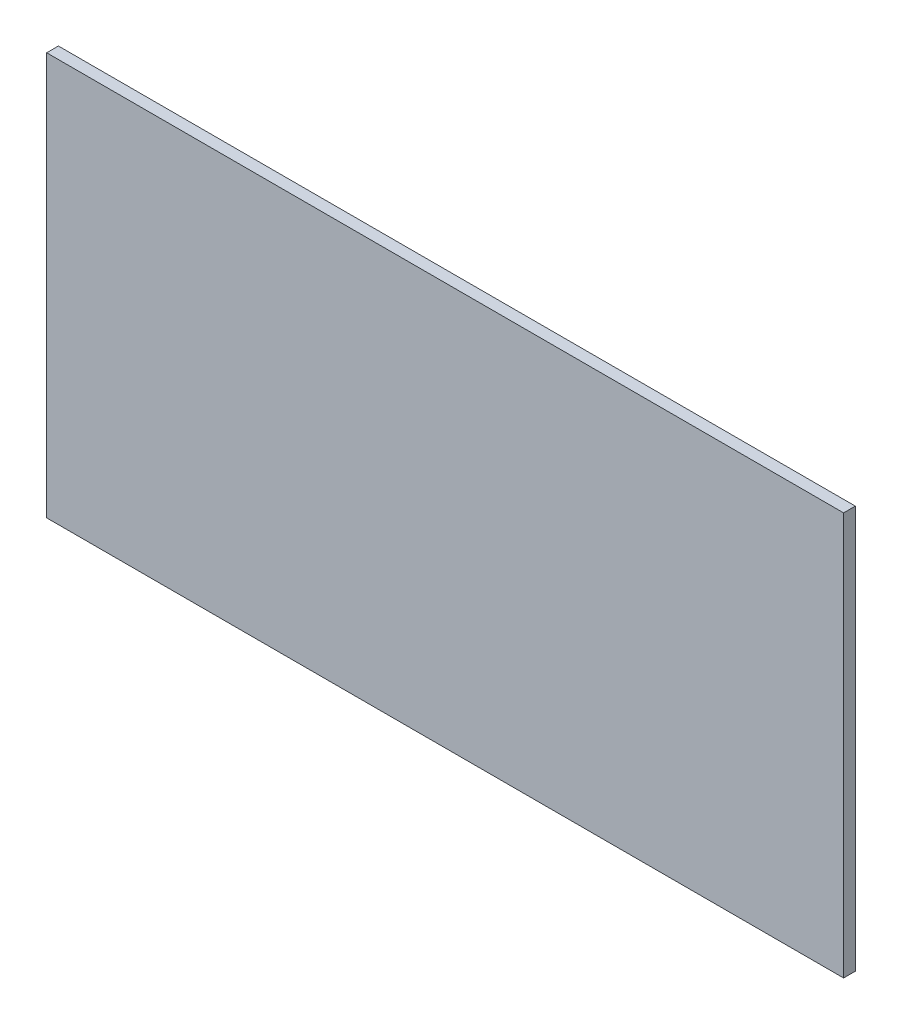
ISO-10303-21;
HEADER;
FILE_DESCRIPTION(('STEP AP214'),'2;1');
FILE_NAME('part.step','',(''),(''),'','','');
FILE_SCHEMA(('AUTOMOTIVE_DESIGN { 1 0 10303 214 1 1 1 1 }'));
ENDSEC;
DATA;
#1=APPLICATION_CONTEXT('core data for automotive mechanical design processes');
#2=APPLICATION_PROTOCOL_DEFINITION('international standard','automotive_design',2000,#1);
#3=PRODUCT_CONTEXT('',#1,'mechanical');
#4=PRODUCT('Part','Part','',(#3));
#5=PRODUCT_RELATED_PRODUCT_CATEGORY('part','',(#4));
#6=PRODUCT_DEFINITION_FORMATION('','',#4);
#7=PRODUCT_DEFINITION_CONTEXT('part definition',#1,'design');
#8=PRODUCT_DEFINITION('design','',#6,#7);
#9=PRODUCT_DEFINITION_SHAPE('','',#8);
#10=(LENGTH_UNIT() NAMED_UNIT(*) SI_UNIT(.MILLI.,.METRE.));
#11=(NAMED_UNIT(*) PLANE_ANGLE_UNIT() SI_UNIT($,.RADIAN.));
#12=(NAMED_UNIT(*) SI_UNIT($,.STERADIAN.) SOLID_ANGLE_UNIT());
#13=UNCERTAINTY_MEASURE_WITH_UNIT(LENGTH_MEASURE(1.E-05),#10,'distance_accuracy_value','');
#14=(GEOMETRIC_REPRESENTATION_CONTEXT(3) GLOBAL_UNCERTAINTY_ASSIGNED_CONTEXT((#13)) GLOBAL_UNIT_ASSIGNED_CONTEXT((#10,
#11,#12)) REPRESENTATION_CONTEXT('',''));
#15=CARTESIAN_POINT('',(0.,0.,0.));
#16=DIRECTION('',(0.,0.,1.));
#17=DIRECTION('',(1.,0.,0.));
#18=AXIS2_PLACEMENT_3D('',#15,#16,#17);
#19=CARTESIAN_POINT('',(54.3900748038679,27.4927932858967,1.6));
#20=DIRECTION('',(-1.,0.,0.));
#21=DIRECTION('',(0.,0.,1.));
#22=AXIS2_PLACEMENT_3D('',#19,#20,#21);
#23=PLANE('',#22);
#24=DIRECTION('',(0.,1.,0.));
#25=VECTOR('',#24,1.);
#26=CARTESIAN_POINT('',(54.3900748038679,27.4927932858967,0.));
#27=LINE('',#26,#25);
#28=CARTESIAN_POINT('',(54.3900748038679,-27.4927932858967,0.));
#29=VERTEX_POINT('',#28);
#30=CARTESIAN_POINT('',(54.3900748038679,27.4927932858967,0.));
#31=VERTEX_POINT('',#30);
#32=EDGE_CURVE('E96',#29,#31,#27,.T.);
#33=ORIENTED_EDGE('',*,*,#32,.T.);
#34=DIRECTION('',(0.,0.,-1.));
#35=VECTOR('',#34,1.);
#36=CARTESIAN_POINT('',(54.3900748038679,27.4927932858967,1.6));
#37=LINE('',#36,#35);
#38=CARTESIAN_POINT('',(54.3900748038679,27.4927932858967,1.6));
#39=VERTEX_POINT('',#38);
#40=EDGE_CURVE('E11',#39,#31,#37,.T.);
#41=ORIENTED_EDGE('',*,*,#40,.F.);
#42=DIRECTION('',(0.,1.,0.));
#43=VECTOR('',#42,1.);
#44=CARTESIAN_POINT('',(54.3900748038679,27.4927932858967,1.6));
#45=LINE('',#44,#43);
#46=CARTESIAN_POINT('',(54.3900748038679,-27.4927932858967,1.6));
#47=VERTEX_POINT('',#46);
#48=EDGE_CURVE('E84',#47,#39,#45,.T.);
#49=ORIENTED_EDGE('',*,*,#48,.F.);
#50=DIRECTION('',(0.,0.,-1.));
#51=VECTOR('',#50,1.);
#52=CARTESIAN_POINT('',(54.3900748038679,-27.4927932858967,1.6));
#53=LINE('',#52,#51);
#54=EDGE_CURVE('E92',#47,#29,#53,.T.);
#55=ORIENTED_EDGE('',*,*,#54,.T.);
#56=EDGE_LOOP('',(#33,#41,#49,#55));
#57=FACE_BOUND('',#56,.T.);
#58=ADVANCED_FACE('F33',(#57),#23,.F.);
#59=CARTESIAN_POINT('',(-54.3900748038679,27.4927932858967,1.6));
#60=DIRECTION('',(0.,-1.,0.));
#61=DIRECTION('',(0.,0.,-1.));
#62=AXIS2_PLACEMENT_3D('',#59,#60,#61);
#63=PLANE('',#62);
#64=DIRECTION('',(-1.,0.,0.));
#65=VECTOR('',#64,1.);
#66=CARTESIAN_POINT('',(-54.3900748038679,27.4927932858967,0.));
#67=LINE('',#66,#65);
#68=CARTESIAN_POINT('',(-54.3900748038679,27.4927932858967,0.));
#69=VERTEX_POINT('',#68);
#70=EDGE_CURVE('E88',#31,#69,#67,.T.);
#71=ORIENTED_EDGE('',*,*,#70,.T.);
#72=DIRECTION('',(0.,0.,-1.));
#73=VECTOR('',#72,1.);
#74=CARTESIAN_POINT('',(-54.3900748038679,27.4927932858967,1.6));
#75=LINE('',#74,#73);
#76=CARTESIAN_POINT('',(-54.3900748038679,27.4927932858967,1.6));
#77=VERTEX_POINT('',#76);
#78=EDGE_CURVE('E41',#77,#69,#75,.T.);
#79=ORIENTED_EDGE('',*,*,#78,.F.);
#80=DIRECTION('',(-1.,0.,0.));
#81=VECTOR('',#80,1.);
#82=CARTESIAN_POINT('',(-54.3900748038679,27.4927932858967,1.6));
#83=LINE('',#82,#81);
#84=EDGE_CURVE('E79',#39,#77,#83,.T.);
#85=ORIENTED_EDGE('',*,*,#84,.F.);
#86=ORIENTED_EDGE('',*,*,#40,.T.);
#87=EDGE_LOOP('',(#71,#79,#85,#86));
#88=FACE_BOUND('',#87,.T.);
#89=ADVANCED_FACE('F87',(#88),#63,.F.);
#90=CARTESIAN_POINT('',(-54.3900748038679,27.4927932858967,1.6));
#91=DIRECTION('',(1.,0.,0.));
#92=DIRECTION('',(0.,0.,-1.));
#93=AXIS2_PLACEMENT_3D('',#90,#91,#92);
#94=PLANE('',#93);
#95=DIRECTION('',(0.,-1.,0.));
#96=VECTOR('',#95,1.);
#97=CARTESIAN_POINT('',(-54.3900748038679,27.4927932858967,0.));
#98=LINE('',#97,#96);
#99=CARTESIAN_POINT('',(-54.3900748038679,-27.4927932858967,0.));
#100=VERTEX_POINT('',#99);
#101=EDGE_CURVE('E66',#69,#100,#98,.T.);
#102=ORIENTED_EDGE('',*,*,#101,.T.);
#103=DIRECTION('',(0.,0.,-1.));
#104=VECTOR('',#103,1.);
#105=CARTESIAN_POINT('',(-54.3900748038679,-27.4927932858967,1.6));
#106=LINE('',#105,#104);
#107=CARTESIAN_POINT('',(-54.3900748038679,-27.4927932858967,1.6));
#108=VERTEX_POINT('',#107);
#109=EDGE_CURVE('E89',#108,#100,#106,.T.);
#110=ORIENTED_EDGE('',*,*,#109,.F.);
#111=DIRECTION('',(0.,-1.,0.));
#112=VECTOR('',#111,1.);
#113=CARTESIAN_POINT('',(-54.3900748038679,27.4927932858967,1.6));
#114=LINE('',#113,#112);
#115=EDGE_CURVE('E82',#77,#108,#114,.T.);
#116=ORIENTED_EDGE('',*,*,#115,.F.);
#117=ORIENTED_EDGE('',*,*,#78,.T.);
#118=EDGE_LOOP('',(#102,#110,#116,#117));
#119=FACE_BOUND('',#118,.T.);
#120=ADVANCED_FACE('F90',(#119),#94,.F.);
#121=CARTESIAN_POINT('',(-54.3900748038679,-27.4927932858967,1.6));
#122=DIRECTION('',(0.,1.,0.));
#123=DIRECTION('',(0.,0.,1.));
#124=AXIS2_PLACEMENT_3D('',#121,#122,#123);
#125=PLANE('',#124);
#126=DIRECTION('',(1.,0.,0.));
#127=VECTOR('',#126,1.);
#128=CARTESIAN_POINT('',(-54.3900748038679,-27.4927932858967,0.));
#129=LINE('',#128,#127);
#130=EDGE_CURVE('E72',#100,#29,#129,.T.);
#131=ORIENTED_EDGE('',*,*,#130,.T.);
#132=ORIENTED_EDGE('',*,*,#54,.F.);
#133=DIRECTION('',(1.,0.,0.));
#134=VECTOR('',#133,1.);
#135=CARTESIAN_POINT('',(-54.3900748038679,-27.4927932858967,1.6));
#136=LINE('',#135,#134);
#137=EDGE_CURVE('E49',#108,#47,#136,.T.);
#138=ORIENTED_EDGE('',*,*,#137,.F.);
#139=ORIENTED_EDGE('',*,*,#109,.T.);
#140=EDGE_LOOP('',(#131,#132,#138,#139));
#141=FACE_BOUND('',#140,.T.);
#142=ADVANCED_FACE('F103',(#141),#125,.F.);
#143=CARTESIAN_POINT('',(0.,0.,1.6));
#144=DIRECTION('',(0.,0.,1.));
#145=DIRECTION('',(1.,0.,0.));
#146=AXIS2_PLACEMENT_3D('',#143,#144,#145);
#147=PLANE('',#146);
#148=ORIENTED_EDGE('',*,*,#48,.T.);
#149=ORIENTED_EDGE('',*,*,#84,.T.);
#150=ORIENTED_EDGE('',*,*,#115,.T.);
#151=ORIENTED_EDGE('',*,*,#137,.T.);
#152=EDGE_LOOP('',(#148,#149,#150,#151));
#153=FACE_BOUND('',#152,.T.);
#154=ADVANCED_FACE('F80',(#153),#147,.T.);
#155=CARTESIAN_POINT('',(0.,0.,0.));
#156=DIRECTION('',(0.,0.,1.));
#157=DIRECTION('',(1.,0.,0.));
#158=AXIS2_PLACEMENT_3D('',#155,#156,#157);
#159=PLANE('',#158);
#160=ORIENTED_EDGE('',*,*,#32,.F.);
#161=ORIENTED_EDGE('',*,*,#130,.F.);
#162=ORIENTED_EDGE('',*,*,#101,.F.);
#163=ORIENTED_EDGE('',*,*,#70,.F.);
#164=EDGE_LOOP('',(#160,#161,#162,#163));
#165=FACE_BOUND('',#164,.T.);
#166=ADVANCED_FACE('F106',(#165),#159,.F.);
#167=CLOSED_SHELL('',(#58,#89,#120,#142,#154,#166));
#168=MANIFOLD_SOLID_BREP('B2',#167);
#169=ADVANCED_BREP_SHAPE_REPRESENTATION('',(#18,#168),#14);
#170=SHAPE_DEFINITION_REPRESENTATION(#9,#169);
ENDSEC;
END-ISO-10303-21;
